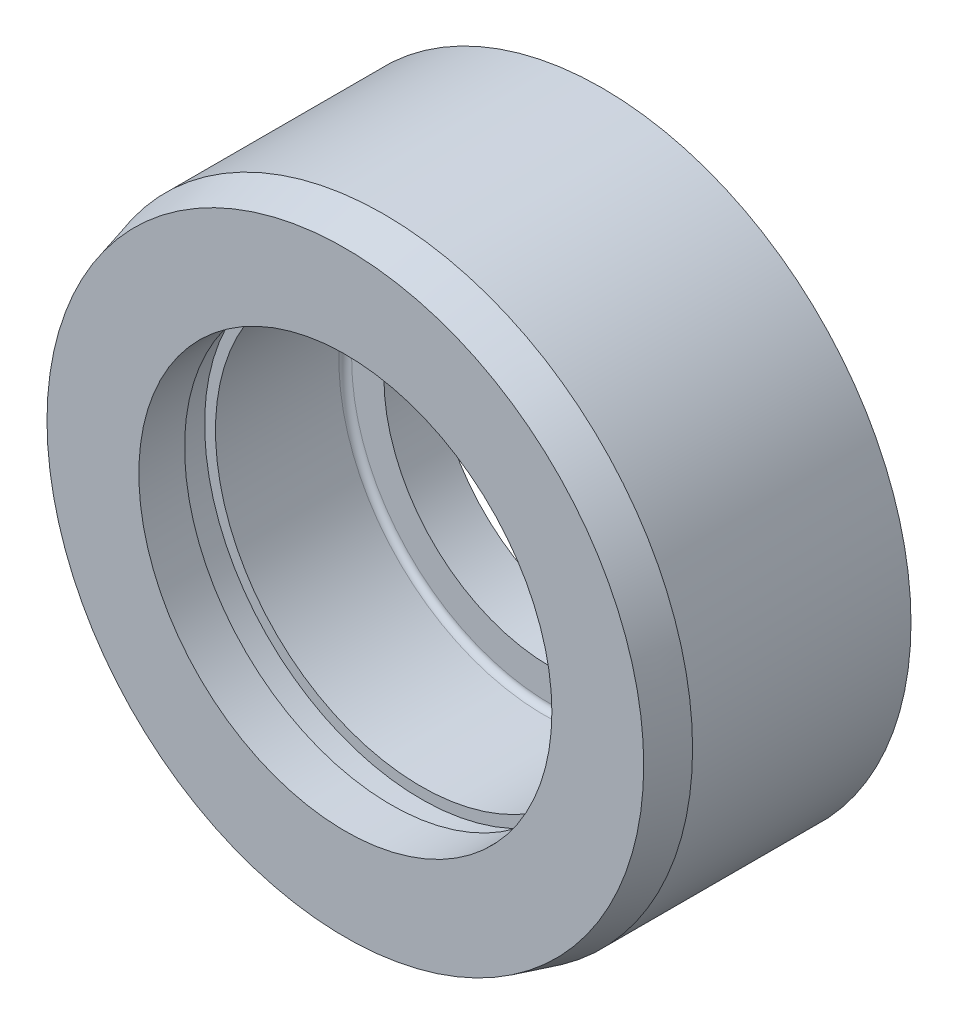
ISO-10303-21;
HEADER;
FILE_DESCRIPTION(('STEP AP214'),'2;1');
FILE_NAME('part.step','',(''),(''),'','','');
FILE_SCHEMA(('AUTOMOTIVE_DESIGN { 1 0 10303 214 1 1 1 1 }'));
ENDSEC;
DATA;
#1=APPLICATION_CONTEXT('core data for automotive mechanical design processes');
#2=APPLICATION_PROTOCOL_DEFINITION('international standard','automotive_design',2000,#1);
#3=PRODUCT_CONTEXT('',#1,'mechanical');
#4=PRODUCT('Part','Part','',(#3));
#5=PRODUCT_RELATED_PRODUCT_CATEGORY('part','',(#4));
#6=PRODUCT_DEFINITION_FORMATION('','',#4);
#7=PRODUCT_DEFINITION_CONTEXT('part definition',#1,'design');
#8=PRODUCT_DEFINITION('design','',#6,#7);
#9=PRODUCT_DEFINITION_SHAPE('','',#8);
#10=(LENGTH_UNIT() NAMED_UNIT(*) SI_UNIT(.MILLI.,.METRE.));
#11=(NAMED_UNIT(*) PLANE_ANGLE_UNIT() SI_UNIT($,.RADIAN.));
#12=(NAMED_UNIT(*) SI_UNIT($,.STERADIAN.) SOLID_ANGLE_UNIT());
#13=UNCERTAINTY_MEASURE_WITH_UNIT(LENGTH_MEASURE(1.E-05),#10,'distance_accuracy_value','');
#14=(GEOMETRIC_REPRESENTATION_CONTEXT(3) GLOBAL_UNCERTAINTY_ASSIGNED_CONTEXT((#13)) GLOBAL_UNIT_ASSIGNED_CONTEXT((#10,
#11,#12)) REPRESENTATION_CONTEXT('',''));
#15=CARTESIAN_POINT('',(0.,0.,0.));
#16=DIRECTION('',(0.,0.,1.));
#17=DIRECTION('',(1.,0.,0.));
#18=AXIS2_PLACEMENT_3D('',#15,#16,#17);
#19=CARTESIAN_POINT('',(0.,0.,2.));
#20=DIRECTION('',(0.,0.,1.));
#21=DIRECTION('',(1.,0.,0.));
#22=AXIS2_PLACEMENT_3D('',#19,#20,#21);
#23=CYLINDRICAL_SURFACE('',#22,8.0045);
#24=CARTESIAN_POINT('',(0.,0.,2.25));
#25=DIRECTION('',(0.,0.,1.));
#26=DIRECTION('',(1.,0.,0.));
#27=AXIS2_PLACEMENT_3D('',#24,#25,#26);
#28=CIRCLE('',#27,8.0045);
#29=CARTESIAN_POINT('',(8.0045,0.,2.25));
#30=VERTEX_POINT('',#29);
#31=EDGE_CURVE('E41',#30,#30,#28,.F.);
#32=ORIENTED_EDGE('',*,*,#31,.T.);
#33=EDGE_LOOP('',(#32));
#34=FACE_BOUND('',#33,.T.);
#35=CARTESIAN_POINT('',(0.,0.,7.05));
#36=DIRECTION('',(0.,0.,1.));
#37=DIRECTION('',(1.,0.,0.));
#38=AXIS2_PLACEMENT_3D('',#35,#36,#37);
#39=CIRCLE('',#38,8.0045);
#40=CARTESIAN_POINT('',(8.0045,0.,7.05));
#41=VERTEX_POINT('',#40);
#42=EDGE_CURVE('E48',#41,#41,#39,.F.);
#43=ORIENTED_EDGE('',*,*,#42,.F.);
#44=EDGE_LOOP('',(#43));
#45=FACE_BOUND('',#44,.T.);
#46=ADVANCED_FACE('F30',(#34,#45),#23,.F.);
#47=CARTESIAN_POINT('',(0.,0.,10.));
#48=DIRECTION('',(0.,0.,-1.));
#49=DIRECTION('',(-1.,0.,0.));
#50=AXIS2_PLACEMENT_3D('',#47,#48,#49);
#51=CYLINDRICAL_SURFACE('',#50,12.0135);
#52=CARTESIAN_POINT('',(0.,0.,8.49999999999998));
#53=DIRECTION('',(0.,0.,1.));
#54=DIRECTION('',(1.,0.,0.));
#55=AXIS2_PLACEMENT_3D('',#52,#53,#54);
#56=CIRCLE('',#55,12.0135);
#57=CARTESIAN_POINT('',(12.0135,0.,8.49999999999998));
#58=VERTEX_POINT('',#57);
#59=EDGE_CURVE('E10',#58,#58,#56,.F.);
#60=ORIENTED_EDGE('',*,*,#59,.T.);
#61=EDGE_LOOP('',(#60));
#62=FACE_BOUND('',#61,.T.);
#63=CARTESIAN_POINT('',(0.,0.,0.));
#64=DIRECTION('',(0.,0.,1.));
#65=DIRECTION('',(1.,0.,0.));
#66=AXIS2_PLACEMENT_3D('',#63,#64,#65);
#67=CIRCLE('',#66,12.0135);
#68=CARTESIAN_POINT('',(12.0135,0.,0.));
#69=VERTEX_POINT('',#68);
#70=EDGE_CURVE('E55',#69,#69,#67,.T.);
#71=ORIENTED_EDGE('',*,*,#70,.T.);
#72=EDGE_LOOP('',(#71));
#73=FACE_BOUND('',#72,.T.);
#74=ADVANCED_FACE('F81',(#62,#73),#51,.T.);
#75=CARTESIAN_POINT('',(0.,0.,10.));
#76=DIRECTION('',(0.,0.,1.));
#77=DIRECTION('',(1.,0.,0.));
#78=AXIS2_PLACEMENT_3D('',#75,#76,#77);
#79=PLANE('',#78);
#80=CARTESIAN_POINT('',(0.,0.,10.));
#81=DIRECTION('',(0.,0.,1.));
#82=DIRECTION('',(1.,0.,0.));
#83=AXIS2_PLACEMENT_3D('',#80,#81,#82);
#84=CIRCLE('',#83,11.6115762113533);
#85=CARTESIAN_POINT('',(11.6115762113533,0.,10.));
#86=VERTEX_POINT('',#85);
#87=EDGE_CURVE('E37',#86,#86,#84,.T.);
#88=ORIENTED_EDGE('',*,*,#87,.T.);
#89=EDGE_LOOP('',(#88));
#90=FACE_BOUND('',#89,.T.);
#91=CARTESIAN_POINT('',(0.,0.,10.));
#92=DIRECTION('',(0.,0.,1.));
#93=DIRECTION('',(1.,0.,0.));
#94=AXIS2_PLACEMENT_3D('',#91,#92,#93);
#95=CIRCLE('',#94,8.0375);
#96=CARTESIAN_POINT('',(8.0375,0.,10.));
#97=VERTEX_POINT('',#96);
#98=EDGE_CURVE('E71',#97,#97,#95,.T.);
#99=ORIENTED_EDGE('',*,*,#98,.F.);
#100=EDGE_LOOP('',(#99));
#101=FACE_BOUND('',#100,.T.);
#102=ADVANCED_FACE('F78',(#90,#101),#79,.T.);
#103=CARTESIAN_POINT('',(0.,0.,0.));
#104=DIRECTION('',(0.,0.,1.));
#105=DIRECTION('',(1.,0.,0.));
#106=AXIS2_PLACEMENT_3D('',#103,#104,#105);
#107=PLANE('',#106);
#108=CARTESIAN_POINT('',(0.,0.,0.));
#109=DIRECTION('',(0.,0.,1.));
#110=DIRECTION('',(1.,0.,0.));
#111=AXIS2_PLACEMENT_3D('',#108,#109,#110);
#112=CIRCLE('',#111,6.50000000000001);
#113=CARTESIAN_POINT('',(6.50000000000001,0.,0.));
#114=VERTEX_POINT('',#113);
#115=EDGE_CURVE('E58',#114,#114,#112,.T.);
#116=ORIENTED_EDGE('',*,*,#115,.T.);
#117=EDGE_LOOP('',(#116));
#118=FACE_BOUND('',#117,.T.);
#119=ORIENTED_EDGE('',*,*,#70,.F.);
#120=EDGE_LOOP('',(#119));
#121=FACE_BOUND('',#120,.T.);
#122=ADVANCED_FACE('F80',(#118,#121),#107,.F.);
#123=CARTESIAN_POINT('',(0.,0.,2.));
#124=DIRECTION('',(0.,0.,1.));
#125=DIRECTION('',(1.,0.,0.));
#126=AXIS2_PLACEMENT_3D('',#123,#124,#125);
#127=PLANE('',#126);
#128=CARTESIAN_POINT('',(0.,0.,2.));
#129=DIRECTION('',(0.,0.,1.));
#130=DIRECTION('',(1.,0.,0.));
#131=AXIS2_PLACEMENT_3D('',#128,#129,#130);
#132=CIRCLE('',#131,7.7545);
#133=CARTESIAN_POINT('',(7.7545,0.,2.));
#134=VERTEX_POINT('',#133);
#135=EDGE_CURVE('E45',#134,#134,#132,.T.);
#136=ORIENTED_EDGE('',*,*,#135,.T.);
#137=EDGE_LOOP('',(#136));
#138=FACE_BOUND('',#137,.T.);
#139=CARTESIAN_POINT('',(0.,0.,2.));
#140=DIRECTION('',(0.,0.,1.));
#141=DIRECTION('',(1.,0.,0.));
#142=AXIS2_PLACEMENT_3D('',#139,#140,#141);
#143=CIRCLE('',#142,6.50000000000001);
#144=CARTESIAN_POINT('',(6.50000000000001,0.,2.));
#145=VERTEX_POINT('',#144);
#146=EDGE_CURVE('E50',#145,#145,#143,.T.);
#147=ORIENTED_EDGE('',*,*,#146,.F.);
#148=EDGE_LOOP('',(#147));
#149=FACE_BOUND('',#148,.T.);
#150=ADVANCED_FACE('F87',(#138,#149),#127,.T.);
#151=CARTESIAN_POINT('',(0.,0.,0.));
#152=DIRECTION('',(0.,0.,1.));
#153=DIRECTION('',(1.,0.,0.));
#154=AXIS2_PLACEMENT_3D('',#151,#152,#153);
#155=CYLINDRICAL_SURFACE('',#154,6.50000000000001);
#156=ORIENTED_EDGE('',*,*,#115,.F.);
#157=EDGE_LOOP('',(#156));
#158=FACE_BOUND('',#157,.T.);
#159=ORIENTED_EDGE('',*,*,#146,.T.);
#160=EDGE_LOOP('',(#159));
#161=FACE_BOUND('',#160,.T.);
#162=ADVANCED_FACE('F100',(#158,#161),#155,.F.);
#163=CARTESIAN_POINT('',(0.,0.,2.25));
#164=DIRECTION('',(0.,0.,1.));
#165=DIRECTION('',(1.,0.,0.));
#166=AXIS2_PLACEMENT_3D('',#163,#164,#165);
#167=TOROIDAL_SURFACE('',#166,7.7545,0.25);
#168=ORIENTED_EDGE('',*,*,#31,.F.);
#169=EDGE_LOOP('',(#168));
#170=FACE_BOUND('',#169,.T.);
#171=ORIENTED_EDGE('',*,*,#135,.F.);
#172=EDGE_LOOP('',(#171));
#173=FACE_BOUND('',#172,.T.);
#174=ADVANCED_FACE('F104',(#170,#173),#167,.F.);
#175=CARTESIAN_POINT('',(0.,0.,7.05));
#176=DIRECTION('',(0.,0.,1.));
#177=DIRECTION('',(1.,0.,0.));
#178=AXIS2_PLACEMENT_3D('',#175,#176,#177);
#179=PLANE('',#178);
#180=CARTESIAN_POINT('',(0.,0.,7.05));
#181=DIRECTION('',(0.,0.,1.));
#182=DIRECTION('',(1.,0.,0.));
#183=AXIS2_PLACEMENT_3D('',#180,#181,#182);
#184=CIRCLE('',#183,8.4275);
#185=CARTESIAN_POINT('',(8.4275,0.,7.05));
#186=VERTEX_POINT('',#185);
#187=EDGE_CURVE('E51',#186,#186,#184,.T.);
#188=ORIENTED_EDGE('',*,*,#187,.T.);
#189=EDGE_LOOP('',(#188));
#190=FACE_BOUND('',#189,.T.);
#191=ORIENTED_EDGE('',*,*,#42,.T.);
#192=EDGE_LOOP('',(#191));
#193=FACE_BOUND('',#192,.T.);
#194=ADVANCED_FACE('F113',(#190,#193),#179,.T.);
#195=CARTESIAN_POINT('',(0.,0.,8.22));
#196=DIRECTION('',(0.,0.,1.));
#197=DIRECTION('',(1.,0.,0.));
#198=AXIS2_PLACEMENT_3D('',#195,#196,#197);
#199=PLANE('',#198);
#200=CARTESIAN_POINT('',(0.,0.,8.22));
#201=DIRECTION('',(0.,0.,1.));
#202=DIRECTION('',(1.,0.,0.));
#203=AXIS2_PLACEMENT_3D('',#200,#201,#202);
#204=CIRCLE('',#203,8.0375);
#205=CARTESIAN_POINT('',(8.0375,0.,8.22));
#206=VERTEX_POINT('',#205);
#207=EDGE_CURVE('E66',#206,#206,#204,.F.);
#208=ORIENTED_EDGE('',*,*,#207,.F.);
#209=EDGE_LOOP('',(#208));
#210=FACE_BOUND('',#209,.T.);
#211=CARTESIAN_POINT('',(0.,0.,8.22));
#212=DIRECTION('',(0.,0.,1.));
#213=DIRECTION('',(1.,0.,0.));
#214=AXIS2_PLACEMENT_3D('',#211,#212,#213);
#215=CIRCLE('',#214,8.4275);
#216=CARTESIAN_POINT('',(8.4275,0.,8.22));
#217=VERTEX_POINT('',#216);
#218=EDGE_CURVE('E63',#217,#217,#215,.T.);
#219=ORIENTED_EDGE('',*,*,#218,.F.);
#220=EDGE_LOOP('',(#219));
#221=FACE_BOUND('',#220,.T.);
#222=ADVANCED_FACE('F109',(#210,#221),#199,.F.);
#223=CARTESIAN_POINT('',(0.,0.,7.05));
#224=DIRECTION('',(0.,0.,1.));
#225=DIRECTION('',(1.,0.,0.));
#226=AXIS2_PLACEMENT_3D('',#223,#224,#225);
#227=CYLINDRICAL_SURFACE('',#226,8.4275);
#228=CARTESIAN_POINT('',(8.4275,0.,7.05));
#229=CARTESIAN_POINT('',(8.4275,0.,7.0621875));
#230=CARTESIAN_POINT('',(8.4275,0.,7.074375));
#231=CARTESIAN_POINT('',(8.4275,0.,7.09875));
#232=CARTESIAN_POINT('',(8.4275,0.,7.1109375));
#233=CARTESIAN_POINT('',(8.4275,0.,7.1353125));
#234=CARTESIAN_POINT('',(8.4275,0.,7.1475));
#235=CARTESIAN_POINT('',(8.4275,0.,7.171875));
#236=CARTESIAN_POINT('',(8.4275,0.,7.1840625));
#237=CARTESIAN_POINT('',(8.4275,0.,7.2084375));
#238=CARTESIAN_POINT('',(8.4275,0.,7.220625));
#239=CARTESIAN_POINT('',(8.4275,0.,7.245));
#240=CARTESIAN_POINT('',(8.4275,0.,7.2571875));
#241=CARTESIAN_POINT('',(8.4275,0.,7.2815625));
#242=CARTESIAN_POINT('',(8.4275,0.,7.29375));
#243=CARTESIAN_POINT('',(8.4275,0.,7.318125));
#244=CARTESIAN_POINT('',(8.4275,0.,7.3303125));
#245=CARTESIAN_POINT('',(8.4275,0.,7.3546875));
#246=CARTESIAN_POINT('',(8.4275,0.,7.366875));
#247=CARTESIAN_POINT('',(8.4275,0.,7.39125));
#248=CARTESIAN_POINT('',(8.4275,0.,7.4034375));
#249=CARTESIAN_POINT('',(8.4275,0.,7.4278125));
#250=CARTESIAN_POINT('',(8.4275,0.,7.44));
#251=CARTESIAN_POINT('',(8.4275,0.,7.464375));
#252=CARTESIAN_POINT('',(8.4275,0.,7.4765625));
#253=CARTESIAN_POINT('',(8.4275,0.,7.5009375));
#254=CARTESIAN_POINT('',(8.4275,0.,7.513125));
#255=CARTESIAN_POINT('',(8.4275,0.,7.5375));
#256=CARTESIAN_POINT('',(8.4275,0.,7.5496875));
#257=CARTESIAN_POINT('',(8.4275,0.,7.5740625));
#258=CARTESIAN_POINT('',(8.4275,0.,7.58625));
#259=CARTESIAN_POINT('',(8.4275,0.,7.610625));
#260=CARTESIAN_POINT('',(8.4275,0.,7.6228125));
#261=CARTESIAN_POINT('',(8.4275,0.,7.6471875));
#262=CARTESIAN_POINT('',(8.4275,0.,7.659375));
#263=CARTESIAN_POINT('',(8.4275,0.,7.68375));
#264=CARTESIAN_POINT('',(8.4275,0.,7.6959375));
#265=CARTESIAN_POINT('',(8.4275,0.,7.7203125));
#266=CARTESIAN_POINT('',(8.4275,0.,7.7325));
#267=CARTESIAN_POINT('',(8.4275,0.,7.756875));
#268=CARTESIAN_POINT('',(8.4275,0.,7.7690625));
#269=CARTESIAN_POINT('',(8.4275,0.,7.7934375));
#270=CARTESIAN_POINT('',(8.4275,0.,7.805625));
#271=CARTESIAN_POINT('',(8.4275,0.,7.83));
#272=CARTESIAN_POINT('',(8.4275,0.,7.8421875));
#273=CARTESIAN_POINT('',(8.4275,0.,7.8665625));
#274=CARTESIAN_POINT('',(8.4275,0.,7.87875));
#275=CARTESIAN_POINT('',(8.4275,0.,7.903125));
#276=CARTESIAN_POINT('',(8.4275,0.,7.9153125));
#277=CARTESIAN_POINT('',(8.4275,0.,7.9396875));
#278=CARTESIAN_POINT('',(8.4275,0.,7.951875));
#279=CARTESIAN_POINT('',(8.4275,0.,7.97625));
#280=CARTESIAN_POINT('',(8.4275,0.,7.9884375));
#281=CARTESIAN_POINT('',(8.4275,0.,8.0128125));
#282=CARTESIAN_POINT('',(8.4275,0.,8.025));
#283=CARTESIAN_POINT('',(8.4275,0.,8.049375));
#284=CARTESIAN_POINT('',(8.4275,0.,8.0615625));
#285=CARTESIAN_POINT('',(8.4275,0.,8.0859375));
#286=CARTESIAN_POINT('',(8.4275,0.,8.098125));
#287=CARTESIAN_POINT('',(8.4275,0.,8.1225));
#288=CARTESIAN_POINT('',(8.4275,0.,8.1346875));
#289=CARTESIAN_POINT('',(8.4275,0.,8.1590625));
#290=CARTESIAN_POINT('',(8.4275,0.,8.17125));
#291=CARTESIAN_POINT('',(8.4275,0.,8.195625));
#292=CARTESIAN_POINT('',(8.4275,0.,8.2078125));
#293=CARTESIAN_POINT('',(8.4275,0.,8.22));
#294=B_SPLINE_CURVE_WITH_KNOTS('',3,(#228,#229,#230,#231,#232,#233,#234,#235,#236,#237,#238,
#239,#240,#241,#242,#243,#244,#245,#246,#247,#248,#249,#250,#251,#252,#253,#254,#255,#256,#257,
#258,#259,#260,#261,#262,#263,#264,#265,#266,#267,#268,#269,#270,#271,#272,#273,#274,#275,#276,
#277,#278,#279,#280,#281,#282,#283,#284,#285,#286,#287,#288,#289,#290,#291,#292,#293),
.UNSPECIFIED.,.F.,.F.,(4,2,2,2,2,2,2,2,2,2,2,2,2,2,2,2,2,2,2,2,2,2,2,2,2,2,2,2,2,2,2,2,4),(0.,
0.0365625000000001,0.0731250000000003,0.1096875,0.146250000000001,0.182812500000001,
0.219375000000001,0.2559375,0.2925,0.3290625,0.365625,0.402187500000001,0.438750000000001,
0.4753125,0.511875,0.5484375,0.585,0.621562500000001,0.658125000000001,0.6946875,0.73125,
0.767812500000001,0.804375,0.8409375,0.8775,0.9140625,0.950625,0.9871875,1.02375,1.0603125,
1.096875,1.1334375,1.17),.UNSPECIFIED.);
#295=EDGE_CURVE('BSEAM106',#186,#217,#294,.T.);
#296=ORIENTED_EDGE('',*,*,#187,.F.);
#297=ORIENTED_EDGE('',*,*,#218,.T.);
#298=ORIENTED_EDGE('',*,*,#295,.T.);
#299=ORIENTED_EDGE('',*,*,#295,.F.);
#300=EDGE_LOOP('',(#296,#298,#297,#299));
#301=FACE_BOUND('',#300,.T.);
#302=ADVANCED_FACE('F106',(#301),#227,.F.);
#303=CARTESIAN_POINT('',(0.,0.,-0.000999999999999265));
#304=DIRECTION('',(0.,0.,1.));
#305=DIRECTION('',(1.,0.,0.));
#306=AXIS2_PLACEMENT_3D('',#303,#304,#305);
#307=CYLINDRICAL_SURFACE('',#306,8.0375);
#308=ORIENTED_EDGE('',*,*,#98,.T.);
#309=EDGE_LOOP('',(#308));
#310=FACE_BOUND('',#309,.T.);
#311=ORIENTED_EDGE('',*,*,#207,.T.);
#312=EDGE_LOOP('',(#311));
#313=FACE_BOUND('',#312,.T.);
#314=ADVANCED_FACE('F75',(#310,#313),#307,.F.);
#315=CARTESIAN_POINT('',(0.,0.,10.));
#316=DIRECTION('',(0.,0.,-1.));
#317=DIRECTION('',(-1.,0.,0.));
#318=AXIS2_PLACEMENT_3D('',#315,#316,#317);
#319=CONICAL_SURFACE('',#318,11.6115762113533,0.261799387799146);
#320=ORIENTED_EDGE('',*,*,#59,.F.);
#321=EDGE_LOOP('',(#320));
#322=FACE_BOUND('',#321,.T.);
#323=ORIENTED_EDGE('',*,*,#87,.F.);
#324=EDGE_LOOP('',(#323));
#325=FACE_BOUND('',#324,.T.);
#326=ADVANCED_FACE('F32',(#322,#325),#319,.T.);
#327=CLOSED_SHELL('',(#46,#74,#102,#122,#150,#162,#174,#194,#222,#302,#314,#326));
#328=MANIFOLD_SOLID_BREP('B2',#327);
#329=ADVANCED_BREP_SHAPE_REPRESENTATION('',(#18,#328),#14);
#330=SHAPE_DEFINITION_REPRESENTATION(#9,#329);
ENDSEC;
END-ISO-10303-21;
